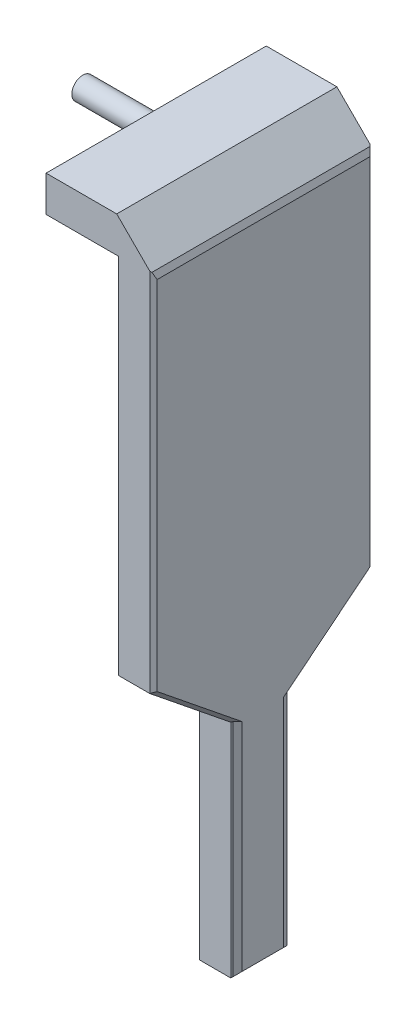
ISO-10303-21;
HEADER;
FILE_DESCRIPTION(('STEP AP214'),'2;1');
FILE_NAME('part.step','',(''),(''),'','','');
FILE_SCHEMA(('AUTOMOTIVE_DESIGN { 1 0 10303 214 1 1 1 1 }'));
ENDSEC;
DATA;
#1=APPLICATION_CONTEXT('core data for automotive mechanical design processes');
#2=APPLICATION_PROTOCOL_DEFINITION('international standard','automotive_design',2000,#1);
#3=PRODUCT_CONTEXT('',#1,'mechanical');
#4=PRODUCT('Part','Part','',(#3));
#5=PRODUCT_RELATED_PRODUCT_CATEGORY('part','',(#4));
#6=PRODUCT_DEFINITION_FORMATION('','',#4);
#7=PRODUCT_DEFINITION_CONTEXT('part definition',#1,'design');
#8=PRODUCT_DEFINITION('design','',#6,#7);
#9=PRODUCT_DEFINITION_SHAPE('','',#8);
#10=(LENGTH_UNIT() NAMED_UNIT(*) SI_UNIT(.MILLI.,.METRE.));
#11=(NAMED_UNIT(*) PLANE_ANGLE_UNIT() SI_UNIT($,.RADIAN.));
#12=(NAMED_UNIT(*) SI_UNIT($,.STERADIAN.) SOLID_ANGLE_UNIT());
#13=UNCERTAINTY_MEASURE_WITH_UNIT(LENGTH_MEASURE(1.E-05),#10,'distance_accuracy_value','');
#14=(GEOMETRIC_REPRESENTATION_CONTEXT(3) GLOBAL_UNCERTAINTY_ASSIGNED_CONTEXT((#13)) GLOBAL_UNIT_ASSIGNED_CONTEXT((#10,
#11,#12)) REPRESENTATION_CONTEXT('',''));
#15=CARTESIAN_POINT('',(0.,0.,0.));
#16=DIRECTION('',(0.,0.,1.));
#17=DIRECTION('',(1.,0.,0.));
#18=AXIS2_PLACEMENT_3D('',#15,#16,#17);
#19=CARTESIAN_POINT('',(-2.46265411376953,3.73344910144806,1.5));
#20=DIRECTION('',(-1.,0.,0.));
#21=DIRECTION('',(0.,0.,1.));
#22=AXIS2_PLACEMENT_3D('',#19,#20,#21);
#23=PLANE('',#22);
#24=CARTESIAN_POINT('',(-2.46265411376953,3.73344910144806,1.5));
#25=DIRECTION('',(-1.,0.,0.));
#26=DIRECTION('',(0.,0.,1.));
#27=AXIS2_PLACEMENT_3D('',#24,#25,#26);
#28=CIRCLE('',#27,0.15);
#29=CARTESIAN_POINT('',(-2.46265411376953,3.73344910144806,1.65));
#30=VERTEX_POINT('',#29);
#31=EDGE_CURVE('E20',#30,#30,#28,.F.);
#32=ORIENTED_EDGE('',*,*,#31,.F.);
#33=EDGE_LOOP('',(#32));
#34=FACE_BOUND('',#33,.T.);
#35=ADVANCED_FACE('F17',(#34),#23,.T.);
#36=CARTESIAN_POINT('',(-0.249999999999999,3.72729980945588,0.));
#37=DIRECTION('',(0.707106781186554,0.707106781186541,0.));
#38=DIRECTION('',(-0.707106781186541,0.707106781186554,0.));
#39=AXIS2_PLACEMENT_3D('',#36,#37,#38);
#40=PLANE('',#39);
#41=DIRECTION('',(0.577350269189646,-0.57735026918965,-0.577350269189581));
#42=VECTOR('',#41,1.);
#43=CARTESIAN_POINT('',(-0.0499999999999962,3.52729980945587,3.));
#44=LINE('',#43,#42);
#45=CARTESIAN_POINT('',(-0.049999999999998,3.52729980945587,3.));
#46=VERTEX_POINT('',#45);
#47=CARTESIAN_POINT('',(-0.0353553390593261,3.5126551485152,2.98535533905933));
#48=VERTEX_POINT('',#47);
#49=EDGE_CURVE('E182',#46,#48,#44,.T.);
#50=ORIENTED_EDGE('',*,*,#49,.T.);
#51=DIRECTION('',(0.,0.,1.));
#52=VECTOR('',#51,1.);
#53=CARTESIAN_POINT('',(-0.0353553390593256,3.5126551485152,0.));
#54=LINE('',#53,#52);
#55=CARTESIAN_POINT('',(-0.0353553390593256,3.5126551485152,0.0146446609406731));
#56=VERTEX_POINT('',#55);
#57=EDGE_CURVE('E214',#56,#48,#54,.T.);
#58=ORIENTED_EDGE('',*,*,#57,.F.);
#59=DIRECTION('',(-0.577350269189601,0.577350269189613,-0.577350269189663));
#60=VECTOR('',#59,1.);
#61=CARTESIAN_POINT('',(-0.0353553390593249,3.5126551485152,0.0146446609406731));
#62=LINE('',#61,#60);
#63=CARTESIAN_POINT('',(-0.0499999999999982,3.52729980945587,0.));
#64=VERTEX_POINT('',#63);
#65=EDGE_CURVE('E200',#56,#64,#62,.T.);
#66=ORIENTED_EDGE('',*,*,#65,.T.);
#67=DIRECTION('',(-0.707106781186541,0.707106781186554,0.));
#68=VECTOR('',#67,1.);
#69=CARTESIAN_POINT('',(-0.249999999999999,3.72729980945588,0.));
#70=LINE('',#69,#68);
#71=CARTESIAN_POINT('',(-0.499999999999997,3.97729980945588,0.));
#72=VERTEX_POINT('',#71);
#73=EDGE_CURVE('E188',#64,#72,#70,.T.);
#74=ORIENTED_EDGE('',*,*,#73,.T.);
#75=DIRECTION('',(0.,0.,1.));
#76=VECTOR('',#75,1.);
#77=CARTESIAN_POINT('',(-0.499999999999998,3.97729980945588,0.));
#78=LINE('',#77,#76);
#79=CARTESIAN_POINT('',(-0.499999999999998,3.97729980945588,3.));
#80=VERTEX_POINT('',#79);
#81=EDGE_CURVE('E255',#80,#72,#78,.F.);
#82=ORIENTED_EDGE('',*,*,#81,.F.);
#83=DIRECTION('',(-0.707106781186541,0.707106781186554,0.));
#84=VECTOR('',#83,1.);
#85=CARTESIAN_POINT('',(-0.249999999999999,3.72729980945588,3.));
#86=LINE('',#85,#84);
#87=EDGE_CURVE('E199',#80,#46,#86,.F.);
#88=ORIENTED_EDGE('',*,*,#87,.T.);
#89=EDGE_LOOP('',(#50,#58,#66,#74,#82,#88));
#90=FACE_BOUND('',#89,.T.);
#91=ADVANCED_FACE('F212',(#90),#40,.T.);
#92=CARTESIAN_POINT('',(-0.0176776695296637,-1.69490341842175,1.83877759457087));
#93=DIRECTION('',(0.923879532511287,0.,0.382683432365089));
#94=DIRECTION('',(0.382683432365089,0.,-0.923879532511287));
#95=AXIS2_PLACEMENT_3D('',#92,#93,#94);
#96=PLANE('',#95);
#97=DIRECTION('',(0.,1.,0.));
#98=VECTOR('',#97,1.);
#99=CARTESIAN_POINT('',(-0.0353553390593237,-2.41558381915093,1.88145526410053));
#100=LINE('',#99,#98);
#101=CARTESIAN_POINT('',(-0.0353553390593261,-5.35147049189518,1.88145526410053));
#102=VERTEX_POINT('',#101);
#103=CARTESIAN_POINT('',(-0.0353553390593248,-2.3407707983818,1.88145526410053));
#104=VERTEX_POINT('',#103);
#105=EDGE_CURVE('E245',#102,#104,#100,.T.);
#106=ORIENTED_EDGE('',*,*,#105,.F.);
#107=DIRECTION('',(0.357406744336585,0.357406744336647,-0.862856209460998));
#108=VECTOR('',#107,1.);
#109=CARTESIAN_POINT('',(-0.035355339059326,-5.35147049189518,1.88145526410053));
#110=LINE('',#109,#108);
#111=CARTESIAN_POINT('',(0.,-5.31611515283585,1.79609992504121));
#112=VERTEX_POINT('',#111);
#113=EDGE_CURVE('E269',#102,#112,#110,.T.);
#114=ORIENTED_EDGE('',*,*,#113,.T.);
#115=DIRECTION('',(0.,1.,0.));
#116=VECTOR('',#115,1.);
#117=CARTESIAN_POINT('',(0.,-0.974223017692566,1.79609992504121));
#118=LINE('',#117,#116);
#119=CARTESIAN_POINT('',(0.,-2.36418578676339,1.79609992504121));
#120=VERTEX_POINT('',#119);
#121=EDGE_CURVE('E236',#120,#112,#118,.F.);
#122=ORIENTED_EDGE('',*,*,#121,.F.);
#123=DIRECTION('',(-0.370955086235393,0.245674607156753,0.89556480022077));
#124=VECTOR('',#123,1.);
#125=CARTESIAN_POINT('',(0.,-2.36418578676339,1.79609992504121));
#126=LINE('',#125,#124);
#127=EDGE_CURVE('E271',#120,#104,#126,.T.);
#128=ORIENTED_EDGE('',*,*,#127,.T.);
#129=EDGE_LOOP('',(#106,#114,#122,#128));
#130=FACE_BOUND('',#129,.T.);
#131=ADVANCED_FACE('F491',(#130),#96,.T.);
#132=CARTESIAN_POINT('',(-0.0176776695296637,-1.69490341842175,1.18553132533577));
#133=DIRECTION('',(0.923879532511286,0.,-0.382683432365091));
#134=DIRECTION('',(-0.382683432365091,0.,-0.923879532511286));
#135=AXIS2_PLACEMENT_3D('',#132,#133,#134);
#136=PLANE('',#135);
#137=DIRECTION('',(0.,1.,0.));
#138=VECTOR('',#137,1.);
#139=CARTESIAN_POINT('',(-0.0353553390593287,-2.41558381915093,1.1428536558061));
#140=LINE('',#139,#138);
#141=CARTESIAN_POINT('',(-0.0353553390593299,-2.34077079838181,1.1428536558061));
#142=VERTEX_POINT('',#141);
#143=CARTESIAN_POINT('',(-0.0353553390593292,-5.35147049189518,1.1428536558061));
#144=VERTEX_POINT('',#143);
#145=EDGE_CURVE('E251',#142,#144,#140,.F.);
#146=ORIENTED_EDGE('',*,*,#145,.F.);
#147=DIRECTION('',(0.370955086235407,-0.245674607156632,0.895564800220797));
#148=VECTOR('',#147,1.);
#149=CARTESIAN_POINT('',(-0.0353553390593296,-2.34077079838181,1.1428536558061));
#150=LINE('',#149,#148);
#151=CARTESIAN_POINT('',(0.,-2.36418578676339,1.22820899486543));
#152=VERTEX_POINT('',#151);
#153=EDGE_CURVE('E265',#142,#152,#150,.T.);
#154=ORIENTED_EDGE('',*,*,#153,.T.);
#155=DIRECTION('',(0.,1.,0.));
#156=VECTOR('',#155,1.);
#157=CARTESIAN_POINT('',(0.,-0.974223017692566,1.22820899486543));
#158=LINE('',#157,#156);
#159=CARTESIAN_POINT('',(0.,-5.31611515283585,1.22820899486543));
#160=VERTEX_POINT('',#159);
#161=EDGE_CURVE('E228',#160,#152,#158,.T.);
#162=ORIENTED_EDGE('',*,*,#161,.F.);
#163=DIRECTION('',(-0.357406744336591,-0.357406744336616,-0.862856209461008));
#164=VECTOR('',#163,1.);
#165=CARTESIAN_POINT('',(0.,-5.31611515283585,1.22820899486543));
#166=LINE('',#165,#164);
#167=EDGE_CURVE('E267',#160,#144,#166,.T.);
#168=ORIENTED_EDGE('',*,*,#167,.T.);
#169=EDGE_LOOP('',(#146,#154,#162,#168));
#170=FACE_BOUND('',#169,.T.);
#171=ADVANCED_FACE('F484',(#170),#136,.T.);
#172=CARTESIAN_POINT('',(-0.0176776695296635,3.46997747898554,0.));
#173=DIRECTION('',(0.923879532511289,0.382683432365085,0.));
#174=DIRECTION('',(-0.382683432365085,0.923879532511289,0.));
#175=AXIS2_PLACEMENT_3D('',#172,#173,#174);
#176=PLANE('',#175);
#177=DIRECTION('',(0.,0.,-1.));
#178=VECTOR('',#177,1.);
#179=CARTESIAN_POINT('',(0.,3.42729980945587,0.));
#180=LINE('',#179,#178);
#181=CARTESIAN_POINT('',(0.,3.42729980945587,0.0499999999999999));
#182=VERTEX_POINT('',#181);
#183=CARTESIAN_POINT('',(0.,3.42729980945587,2.95));
#184=VERTEX_POINT('',#183);
#185=EDGE_CURVE('E221',#182,#184,#180,.F.);
#186=ORIENTED_EDGE('',*,*,#185,.F.);
#187=DIRECTION('',(-0.357406744336591,0.862856209461023,-0.357406744336581));
#188=VECTOR('',#187,1.);
#189=CARTESIAN_POINT('',(0.,3.42729980945587,0.05));
#190=LINE('',#189,#188);
#191=EDGE_CURVE('E260',#182,#56,#190,.T.);
#192=ORIENTED_EDGE('',*,*,#191,.T.);
#193=ORIENTED_EDGE('',*,*,#57,.T.);
#194=DIRECTION('',(0.357406744336586,-0.862856209461012,-0.357406744336612));
#195=VECTOR('',#194,1.);
#196=CARTESIAN_POINT('',(-0.0353553390593256,3.5126551485152,2.98535533905933));
#197=LINE('',#196,#195);
#198=EDGE_CURVE('E262',#48,#184,#197,.T.);
#199=ORIENTED_EDGE('',*,*,#198,.T.);
#200=EDGE_LOOP('',(#186,#192,#193,#199));
#201=FACE_BOUND('',#200,.T.);
#202=ADVANCED_FACE('F739',(#201),#176,.T.);
#203=CARTESIAN_POINT('',(-1.46265411376953,3.73344910144806,1.5));
#204=DIRECTION('',(-1.,0.,0.));
#205=DIRECTION('',(0.,0.,1.));
#206=AXIS2_PLACEMENT_3D('',#203,#204,#205);
#207=CYLINDRICAL_SURFACE('',#206,0.15);
#208=CARTESIAN_POINT('',(-1.46265411376953,3.73344910144806,1.5));
#209=DIRECTION('',(-1.,0.,0.));
#210=DIRECTION('',(0.,0.,1.));
#211=AXIS2_PLACEMENT_3D('',#208,#209,#210);
#212=CIRCLE('',#211,0.15);
#213=CARTESIAN_POINT('',(-1.46265411376953,3.73344910144806,1.65));
#214=VERTEX_POINT('',#213);
#215=EDGE_CURVE('E218',#214,#214,#212,.F.);
#216=ORIENTED_EDGE('',*,*,#215,.F.);
#217=EDGE_LOOP('',(#216));
#218=FACE_BOUND('',#217,.T.);
#219=ORIENTED_EDGE('',*,*,#31,.T.);
#220=EDGE_LOOP('',(#219));
#221=FACE_BOUND('',#220,.T.);
#222=ADVANCED_FACE('F731',(#218,#221),#207,.T.);
#223=CARTESIAN_POINT('',(-0.981327056884762,3.97729980945588,0.));
#224=DIRECTION('',(0.,1.,0.));
#225=DIRECTION('',(0.,0.,1.));
#226=AXIS2_PLACEMENT_3D('',#223,#224,#225);
#227=PLANE('',#226);
#228=DIRECTION('',(1.,0.,0.));
#229=VECTOR('',#228,1.);
#230=CARTESIAN_POINT('',(-0.981327056884762,3.97729980945588,0.));
#231=LINE('',#230,#229);
#232=CARTESIAN_POINT('',(-1.46265411376953,3.97729980945588,0.));
#233=VERTEX_POINT('',#232);
#234=EDGE_CURVE('E194',#72,#233,#231,.F.);
#235=ORIENTED_EDGE('',*,*,#234,.T.);
#236=DIRECTION('',(0.,0.,1.));
#237=VECTOR('',#236,1.);
#238=CARTESIAN_POINT('',(-1.46265411376953,3.97729980945588,0.));
#239=LINE('',#238,#237);
#240=CARTESIAN_POINT('',(-1.46265411376953,3.97729980945588,3.));
#241=VERTEX_POINT('',#240);
#242=EDGE_CURVE('E225',#241,#233,#239,.F.);
#243=ORIENTED_EDGE('',*,*,#242,.F.);
#244=DIRECTION('',(1.,0.,0.));
#245=VECTOR('',#244,1.);
#246=CARTESIAN_POINT('',(-0.981327056884762,3.97729980945588,3.));
#247=LINE('',#246,#245);
#248=EDGE_CURVE('E257',#241,#80,#247,.T.);
#249=ORIENTED_EDGE('',*,*,#248,.T.);
#250=ORIENTED_EDGE('',*,*,#81,.T.);
#251=EDGE_LOOP('',(#235,#243,#249,#250));
#252=FACE_BOUND('',#251,.T.);
#253=ADVANCED_FACE('F362',(#252),#227,.T.);
#254=CARTESIAN_POINT('',(-0.025,-2.41558381915093,1.15320899486543));
#255=DIRECTION('',(0.707106781186548,0.,-0.707106781186547));
#256=DIRECTION('',(-0.707106781186547,0.,-0.707106781186548));
#257=AXIS2_PLACEMENT_3D('',#254,#255,#256);
#258=PLANE('',#257);
#259=DIRECTION('',(0.,1.,0.));
#260=VECTOR('',#259,1.);
#261=CARTESIAN_POINT('',(-0.05,-3.85694462060929,1.12820899486543));
#262=LINE('',#261,#260);
#263=CARTESIAN_POINT('',(-0.05,-5.36611515283585,1.12820899486543));
#264=VERTEX_POINT('',#263);
#265=CARTESIAN_POINT('',(-0.0500000000000003,-2.34777408838273,1.12820899486543));
#266=VERTEX_POINT('',#265);
#267=EDGE_CURVE('E343',#264,#266,#262,.T.);
#268=ORIENTED_EDGE('',*,*,#267,.T.);
#269=DIRECTION('',(-0.669846433942967,-0.320330313688414,-0.669846433943014));
#270=VECTOR('',#269,1.);
#271=CARTESIAN_POINT('',(-0.0353553390593315,-2.34077079838181,1.1428536558061));
#272=LINE('',#271,#270);
#273=EDGE_CURVE('E348',#142,#266,#272,.T.);
#274=ORIENTED_EDGE('',*,*,#273,.F.);
#275=ORIENTED_EDGE('',*,*,#145,.T.);
#276=DIRECTION('',(-0.577350269189648,-0.577350269189581,-0.577350269189649));
#277=VECTOR('',#276,1.);
#278=CARTESIAN_POINT('',(-0.0353553390593287,-5.35147049189518,1.1428536558061));
#279=LINE('',#278,#277);
#280=EDGE_CURVE('E248',#144,#264,#279,.T.);
#281=ORIENTED_EDGE('',*,*,#280,.T.);
#282=EDGE_LOOP('',(#268,#274,#275,#281));
#283=FACE_BOUND('',#282,.T.);
#284=ADVANCED_FACE('F474',(#283),#258,.T.);
#285=CARTESIAN_POINT('',(-0.025,-2.41558381915093,1.87109992504121));
#286=DIRECTION('',(0.707106781186548,0.,0.707106781186547));
#287=DIRECTION('',(0.707106781186547,0.,-0.707106781186548));
#288=AXIS2_PLACEMENT_3D('',#285,#286,#287);
#289=PLANE('',#288);
#290=DIRECTION('',(-0.66984643394293,-0.320330313688663,0.669846433942932));
#291=VECTOR('',#290,1.);
#292=CARTESIAN_POINT('',(-0.0353553390593237,-2.3407707983818,1.88145526410053));
#293=LINE('',#292,#291);
#294=CARTESIAN_POINT('',(-0.0500000000000002,-2.34777408838273,1.89609992504121));
#295=VERTEX_POINT('',#294);
#296=EDGE_CURVE('E242',#104,#295,#293,.T.);
#297=ORIENTED_EDGE('',*,*,#296,.T.);
#298=DIRECTION('',(0.,1.,0.));
#299=VECTOR('',#298,1.);
#300=CARTESIAN_POINT('',(-0.05,-3.85694462060929,1.89609992504121));
#301=LINE('',#300,#299);
#302=CARTESIAN_POINT('',(-0.05,-5.36611515283585,1.89609992504121));
#303=VERTEX_POINT('',#302);
#304=EDGE_CURVE('E333',#295,#303,#301,.F.);
#305=ORIENTED_EDGE('',*,*,#304,.T.);
#306=DIRECTION('',(-0.577350269189508,-0.577350269189514,0.577350269189856));
#307=VECTOR('',#306,1.);
#308=CARTESIAN_POINT('',(-0.0353553390593286,-5.35147049189518,1.88145526410053));
#309=LINE('',#308,#307);
#310=EDGE_CURVE('E337',#102,#303,#309,.T.);
#311=ORIENTED_EDGE('',*,*,#310,.F.);
#312=ORIENTED_EDGE('',*,*,#105,.T.);
#313=EDGE_LOOP('',(#297,#305,#311,#312));
#314=FACE_BOUND('',#313,.T.);
#315=ADVANCED_FACE('F494',(#314),#289,.T.);
#316=CARTESIAN_POINT('',(0.,-0.974223017692566,0.));
#317=DIRECTION('',(1.,0.,0.));
#318=DIRECTION('',(0.,0.,-1.));
#319=AXIS2_PLACEMENT_3D('',#316,#317,#318);
#320=PLANE('',#319);
#321=ORIENTED_EDGE('',*,*,#185,.T.);
#322=DIRECTION('',(0.,1.,0.));
#323=VECTOR('',#322,1.);
#324=CARTESIAN_POINT('',(0.,-0.687940733754938,2.95));
#325=LINE('',#324,#323);
#326=CARTESIAN_POINT('',(0.,-1.43362477716847,2.95));
#327=VERTEX_POINT('',#326);
#328=EDGE_CURVE('E327',#327,#184,#325,.T.);
#329=ORIENTED_EDGE('',*,*,#328,.F.);
#330=DIRECTION('',(0.,0.627750993166892,0.778414215297987));
#331=VECTOR('',#330,1.);
#332=CARTESIAN_POINT('',(0.,-2.36418578676339,1.79609992504121));
#333=LINE('',#332,#331);
#334=EDGE_CURVE('E331',#120,#327,#333,.T.);
#335=ORIENTED_EDGE('',*,*,#334,.F.);
#336=ORIENTED_EDGE('',*,*,#121,.T.);
#337=DIRECTION('',(0.,0.,1.));
#338=VECTOR('',#337,1.);
#339=CARTESIAN_POINT('',(0.,-5.31611515283585,0.756077229976659));
#340=LINE('',#339,#338);
#341=EDGE_CURVE('E340',#160,#112,#340,.T.);
#342=ORIENTED_EDGE('',*,*,#341,.F.);
#343=ORIENTED_EDGE('',*,*,#161,.T.);
#344=DIRECTION('',(0.,-0.627750993166894,0.778414215297985));
#345=VECTOR('',#344,1.);
#346=CARTESIAN_POINT('',(0.,-1.41402088464658,0.0500000000000002));
#347=LINE('',#346,#345);
#348=CARTESIAN_POINT('',(0.,-1.41402088464658,0.05));
#349=VERTEX_POINT('',#348);
#350=EDGE_CURVE('E351',#349,#152,#347,.T.);
#351=ORIENTED_EDGE('',*,*,#350,.F.);
#352=DIRECTION('',(0.,1.,0.));
#353=VECTOR('',#352,1.);
#354=CARTESIAN_POINT('',(0.,-0.687940733754938,0.05));
#355=LINE('',#354,#353);
#356=EDGE_CURVE('E354',#182,#349,#355,.F.);
#357=ORIENTED_EDGE('',*,*,#356,.F.);
#358=EDGE_LOOP('',(#321,#329,#335,#336,#342,#343,#351,#357));
#359=FACE_BOUND('',#358,.T.);
#360=ADVANCED_FACE('F487',(#359),#320,.T.);
#361=CARTESIAN_POINT('',(-1.46265411376953,3.73344910144806,0.));
#362=DIRECTION('',(-1.,0.,0.));
#363=DIRECTION('',(0.,0.,1.));
#364=AXIS2_PLACEMENT_3D('',#361,#362,#363);
#365=PLANE('',#364);
#366=DIRECTION('',(0.,1.,0.));
#367=VECTOR('',#366,1.);
#368=CARTESIAN_POINT('',(-1.46265411376953,3.73344910144806,0.));
#369=LINE('',#368,#367);
#370=CARTESIAN_POINT('',(-1.46265411376953,3.48959839344024,0.));
#371=VERTEX_POINT('',#370);
#372=EDGE_CURVE('E356',#233,#371,#369,.F.);
#373=ORIENTED_EDGE('',*,*,#372,.T.);
#374=DIRECTION('',(0.,0.,-1.));
#375=VECTOR('',#374,1.);
#376=CARTESIAN_POINT('',(-1.46265411376953,3.48959839344024,0.));
#377=LINE('',#376,#375);
#378=CARTESIAN_POINT('',(-1.46265411376953,3.48959839344024,3.));
#379=VERTEX_POINT('',#378);
#380=EDGE_CURVE('E322',#379,#371,#377,.T.);
#381=ORIENTED_EDGE('',*,*,#380,.F.);
#382=DIRECTION('',(0.,1.,0.));
#383=VECTOR('',#382,1.);
#384=CARTESIAN_POINT('',(-1.46265411376953,3.73344910144806,3.));
#385=LINE('',#384,#383);
#386=EDGE_CURVE('E220',#379,#241,#385,.T.);
#387=ORIENTED_EDGE('',*,*,#386,.T.);
#388=ORIENTED_EDGE('',*,*,#242,.T.);
#389=EDGE_LOOP('',(#373,#381,#387,#388));
#390=FACE_BOUND('',#389,.T.);
#391=ORIENTED_EDGE('',*,*,#215,.T.);
#392=EDGE_LOOP('',(#391));
#393=FACE_BOUND('',#392,.T.);
#394=ADVANCED_FACE('F359',(#390,#393),#365,.T.);
#395=CARTESIAN_POINT('',(-0.025,-0.687940733754938,0.025));
#396=DIRECTION('',(0.707106781186547,0.,-0.707106781186548));
#397=DIRECTION('',(-0.707106781186548,0.,-0.707106781186547));
#398=AXIS2_PLACEMENT_3D('',#395,#396,#397);
#399=PLANE('',#398);
#400=ORIENTED_EDGE('',*,*,#65,.F.);
#401=ORIENTED_EDGE('',*,*,#191,.F.);
#402=ORIENTED_EDGE('',*,*,#356,.T.);
#403=DIRECTION('',(0.66984643394299,0.320330313688518,0.669846433942942));
#404=VECTOR('',#403,1.);
#405=CARTESIAN_POINT('',(-0.0500000000000024,-1.43793161234897,0.));
#406=LINE('',#405,#404);
#407=CARTESIAN_POINT('',(-0.0500000000000006,-1.43793161234897,0.));
#408=VERTEX_POINT('',#407);
#409=EDGE_CURVE('E207',#408,#349,#406,.T.);
#410=ORIENTED_EDGE('',*,*,#409,.F.);
#411=DIRECTION('',(0.,1.,0.));
#412=VECTOR('',#411,1.);
#413=CARTESIAN_POINT('',(-0.05,-0.401658449817309,0.));
#414=LINE('',#413,#412);
#415=EDGE_CURVE('E192',#408,#64,#414,.T.);
#416=ORIENTED_EDGE('',*,*,#415,.T.);
#417=EDGE_LOOP('',(#400,#401,#402,#410,#416));
#418=FACE_BOUND('',#417,.T.);
#419=ADVANCED_FACE('F203',(#418),#399,.T.);
#420=CARTESIAN_POINT('',(-0.025,-1.54006611336187,0.166471974713435));
#421=DIRECTION('',(0.707106781186547,-0.550421970209211,-0.443886984164901));
#422=DIRECTION('',(0.614253485987459,0.789108772573372,0.));
#423=AXIS2_PLACEMENT_3D('',#420,#421,#422);
#424=PLANE('',#423);
#425=DIRECTION('',(0.,-0.627750993166894,0.778414215297985));
#426=VECTOR('',#425,1.);
#427=CARTESIAN_POINT('',(-0.05,-1.86385557822617,0.528147742152223));
#428=LINE('',#427,#426);
#429=EDGE_CURVE('E314',#266,#408,#428,.F.);
#430=ORIENTED_EDGE('',*,*,#429,.T.);
#431=ORIENTED_EDGE('',*,*,#409,.T.);
#432=ORIENTED_EDGE('',*,*,#350,.T.);
#433=ORIENTED_EDGE('',*,*,#153,.F.);
#434=ORIENTED_EDGE('',*,*,#273,.T.);
#435=EDGE_LOOP('',(#430,#431,#432,#433,#434));
#436=FACE_BOUND('',#435,.T.);
#437=ADVANCED_FACE('F481',(#436),#424,.T.);
#438=CARTESIAN_POINT('',(0.,-3.85694462060929,1.12820899486543));
#439=DIRECTION('',(0.,0.,1.));
#440=DIRECTION('',(1.,0.,0.));
#441=AXIS2_PLACEMENT_3D('',#438,#439,#440);
#442=PLANE('',#441);
#443=DIRECTION('',(1.,0.,0.));
#444=VECTOR('',#443,1.);
#445=CARTESIAN_POINT('',(0.,-2.34777408838273,1.12820899486543));
#446=LINE('',#445,#444);
#447=CARTESIAN_POINT('',(-0.476725769042962,-2.34777408838273,1.12820899486543));
#448=VERTEX_POINT('',#447);
#449=EDGE_CURVE('E316',#448,#266,#446,.T.);
#450=ORIENTED_EDGE('',*,*,#449,.T.);
#451=ORIENTED_EDGE('',*,*,#267,.F.);
#452=DIRECTION('',(1.,0.,0.));
#453=VECTOR('',#452,1.);
#454=CARTESIAN_POINT('',(0.,-5.36611515283585,1.12820899486543));
#455=LINE('',#454,#453);
#456=CARTESIAN_POINT('',(-0.476725769042962,-5.36611515283585,1.12820899486543));
#457=VERTEX_POINT('',#456);
#458=EDGE_CURVE('E345',#457,#264,#455,.T.);
#459=ORIENTED_EDGE('',*,*,#458,.F.);
#460=DIRECTION('',(0.,1.,0.));
#461=VECTOR('',#460,1.);
#462=CARTESIAN_POINT('',(-0.476725769042962,-2.41250917315484,1.12820899486543));
#463=LINE('',#462,#461);
#464=EDGE_CURVE('E309',#448,#457,#463,.F.);
#465=ORIENTED_EDGE('',*,*,#464,.F.);
#466=EDGE_LOOP('',(#450,#451,#459,#465));
#467=FACE_BOUND('',#466,.T.);
#468=ADVANCED_FACE('F478',(#467),#442,.F.);
#469=CARTESIAN_POINT('',(-0.025,-5.34111515283585,0.756077229976659));
#470=DIRECTION('',(0.707106781186548,-0.707106781186547,0.));
#471=DIRECTION('',(0.707106781186547,0.707106781186548,0.));
#472=AXIS2_PLACEMENT_3D('',#469,#470,#471);
#473=PLANE('',#472);
#474=ORIENTED_EDGE('',*,*,#113,.F.);
#475=ORIENTED_EDGE('',*,*,#310,.T.);
#476=DIRECTION('',(0.,0.,1.));
#477=VECTOR('',#476,1.);
#478=CARTESIAN_POINT('',(-0.05,-5.36611515283585,1.51215445995332));
#479=LINE('',#478,#477);
#480=EDGE_CURVE('E301',#303,#264,#479,.F.);
#481=ORIENTED_EDGE('',*,*,#480,.T.);
#482=ORIENTED_EDGE('',*,*,#280,.F.);
#483=ORIENTED_EDGE('',*,*,#167,.F.);
#484=ORIENTED_EDGE('',*,*,#341,.T.);
#485=EDGE_LOOP('',(#474,#475,#481,#482,#483,#484));
#486=FACE_BOUND('',#485,.T.);
#487=ADVANCED_FACE('F470',(#486),#473,.T.);
#488=CARTESIAN_POINT('',(0.,-3.85694462060929,1.89609992504121));
#489=DIRECTION('',(0.,0.,-1.));
#490=DIRECTION('',(-1.,0.,0.));
#491=AXIS2_PLACEMENT_3D('',#488,#489,#490);
#492=PLANE('',#491);
#493=DIRECTION('',(1.,0.,0.));
#494=VECTOR('',#493,1.);
#495=CARTESIAN_POINT('',(0.,-5.36611515283585,1.89609992504121));
#496=LINE('',#495,#494);
#497=CARTESIAN_POINT('',(-0.476725769042962,-5.36611515283585,1.89609992504121));
#498=VERTEX_POINT('',#497);
#499=EDGE_CURVE('E304',#498,#303,#496,.T.);
#500=ORIENTED_EDGE('',*,*,#499,.T.);
#501=ORIENTED_EDGE('',*,*,#304,.F.);
#502=DIRECTION('',(-1.,0.,0.));
#503=VECTOR('',#502,1.);
#504=CARTESIAN_POINT('',(0.,-2.34777408838273,1.89609992504121));
#505=LINE('',#504,#503);
#506=CARTESIAN_POINT('',(-0.476725769042962,-2.34777408838273,1.89609992504121));
#507=VERTEX_POINT('',#506);
#508=EDGE_CURVE('E335',#507,#295,#505,.F.);
#509=ORIENTED_EDGE('',*,*,#508,.F.);
#510=DIRECTION('',(0.,1.,0.));
#511=VECTOR('',#510,1.);
#512=CARTESIAN_POINT('',(-0.476725769042962,-2.41250917315484,1.89609992504121));
#513=LINE('',#512,#511);
#514=EDGE_CURVE('E298',#498,#507,#513,.T.);
#515=ORIENTED_EDGE('',*,*,#514,.F.);
#516=EDGE_LOOP('',(#500,#501,#509,#515));
#517=FACE_BOUND('',#516,.T.);
#518=ADVANCED_FACE('F462',(#517),#492,.F.);
#519=CARTESIAN_POINT('',(-0.025,-2.26788363224052,1.9553397623852));
#520=DIRECTION('',(0.707106781186547,-0.550421970209213,0.443886984164899));
#521=DIRECTION('',(0.61425348598746,0.789108772573372,0.));
#522=AXIS2_PLACEMENT_3D('',#519,#520,#521);
#523=PLANE('',#522);
#524=ORIENTED_EDGE('',*,*,#296,.F.);
#525=ORIENTED_EDGE('',*,*,#127,.F.);
#526=ORIENTED_EDGE('',*,*,#334,.T.);
#527=DIRECTION('',(0.669846433942988,0.320330313688423,-0.669846433942989));
#528=VECTOR('',#527,1.);
#529=CARTESIAN_POINT('',(-0.0500000000000002,-1.45753550487085,3.));
#530=LINE('',#529,#528);
#531=CARTESIAN_POINT('',(-0.0499999999999989,-1.45753550487085,3.));
#532=VERTEX_POINT('',#531);
#533=EDGE_CURVE('E329',#532,#327,#530,.T.);
#534=ORIENTED_EDGE('',*,*,#533,.F.);
#535=DIRECTION('',(0.,0.627750993166891,0.778414215297988));
#536=VECTOR('',#535,1.);
#537=CARTESIAN_POINT('',(-0.05,-1.84166116481183,2.52368235588074));
#538=LINE('',#537,#536);
#539=EDGE_CURVE('E293',#532,#295,#538,.F.);
#540=ORIENTED_EDGE('',*,*,#539,.T.);
#541=EDGE_LOOP('',(#524,#525,#526,#534,#540));
#542=FACE_BOUND('',#541,.T.);
#543=ADVANCED_FACE('F496',(#542),#523,.T.);
#544=CARTESIAN_POINT('',(-0.025,-0.687940733754938,2.975));
#545=DIRECTION('',(0.707106781186548,0.,0.707106781186547));
#546=DIRECTION('',(0.707106781186547,0.,-0.707106781186548));
#547=AXIS2_PLACEMENT_3D('',#544,#545,#546);
#548=PLANE('',#547);
#549=ORIENTED_EDGE('',*,*,#198,.F.);
#550=ORIENTED_EDGE('',*,*,#49,.F.);
#551=DIRECTION('',(0.,1.,0.));
#552=VECTOR('',#551,1.);
#553=CARTESIAN_POINT('',(-0.05,-0.401658449817309,3.));
#554=LINE('',#553,#552);
#555=EDGE_CURVE('E278',#532,#46,#554,.T.);
#556=ORIENTED_EDGE('',*,*,#555,.F.);
#557=ORIENTED_EDGE('',*,*,#533,.T.);
#558=ORIENTED_EDGE('',*,*,#328,.T.);
#559=EDGE_LOOP('',(#549,#550,#556,#557,#558));
#560=FACE_BOUND('',#559,.T.);
#561=ADVANCED_FACE('F646',(#560),#548,.T.);
#562=CARTESIAN_POINT('',(-0.994689941406244,3.48959839344024,0.));
#563=DIRECTION('',(0.,-1.,0.));
#564=DIRECTION('',(0.,0.,-1.));
#565=AXIS2_PLACEMENT_3D('',#562,#563,#564);
#566=PLANE('',#565);
#567=DIRECTION('',(-0.707106781186547,0.,0.707106781186548));
#568=VECTOR('',#567,1.);
#569=CARTESIAN_POINT('',(-0.476725769042962,3.48959839344024,0.));
#570=LINE('',#569,#568);
#571=CARTESIAN_POINT('',(-0.476725769042962,3.48959839344024,0.));
#572=VERTEX_POINT('',#571);
#573=CARTESIAN_POINT('',(-0.576725769042962,3.48959839344024,0.1));
#574=VERTEX_POINT('',#573);
#575=EDGE_CURVE('E210',#572,#574,#570,.T.);
#576=ORIENTED_EDGE('',*,*,#575,.T.);
#577=DIRECTION('',(0.,0.,1.));
#578=VECTOR('',#577,1.);
#579=CARTESIAN_POINT('',(-0.576725769042962,3.48959839344024,0.));
#580=LINE('',#579,#578);
#581=CARTESIAN_POINT('',(-0.576725769042962,3.48959839344024,2.9));
#582=VERTEX_POINT('',#581);
#583=EDGE_CURVE('E282',#582,#574,#580,.F.);
#584=ORIENTED_EDGE('',*,*,#583,.F.);
#585=DIRECTION('',(0.707106781186546,0.,0.707106781186549));
#586=VECTOR('',#585,1.);
#587=CARTESIAN_POINT('',(-0.576725769042962,3.48959839344024,2.9));
#588=LINE('',#587,#586);
#589=CARTESIAN_POINT('',(-0.476725769042962,3.48959839344024,3.));
#590=VERTEX_POINT('',#589);
#591=EDGE_CURVE('E325',#582,#590,#588,.T.);
#592=ORIENTED_EDGE('',*,*,#591,.T.);
#593=DIRECTION('',(1.,0.,0.));
#594=VECTOR('',#593,1.);
#595=CARTESIAN_POINT('',(-0.354521610411887,3.48959839344024,3.));
#596=LINE('',#595,#594);
#597=EDGE_CURVE('E287',#379,#590,#596,.T.);
#598=ORIENTED_EDGE('',*,*,#597,.F.);
#599=ORIENTED_EDGE('',*,*,#380,.T.);
#600=DIRECTION('',(1.,0.,0.));
#601=VECTOR('',#600,1.);
#602=CARTESIAN_POINT('',(-0.354521610411887,3.48959839344024,0.));
#603=LINE('',#602,#601);
#604=EDGE_CURVE('E209',#371,#572,#603,.T.);
#605=ORIENTED_EDGE('',*,*,#604,.T.);
#606=EDGE_LOOP('',(#576,#584,#592,#598,#599,#605));
#607=FACE_BOUND('',#606,.T.);
#608=ADVANCED_FACE('F367',(#607),#566,.T.);
#609=CARTESIAN_POINT('',(-0.354521610411887,-0.401658449817309,0.));
#610=DIRECTION('',(0.,0.,1.));
#611=DIRECTION('',(1.,0.,0.));
#612=AXIS2_PLACEMENT_3D('',#609,#610,#611);
#613=PLANE('',#612);
#614=ORIENTED_EDGE('',*,*,#372,.F.);
#615=ORIENTED_EDGE('',*,*,#234,.F.);
#616=ORIENTED_EDGE('',*,*,#73,.F.);
#617=ORIENTED_EDGE('',*,*,#415,.F.);
#618=DIRECTION('',(1.,0.,0.));
#619=VECTOR('',#618,1.);
#620=CARTESIAN_POINT('',(0.,-1.43793161234897,0.));
#621=LINE('',#620,#619);
#622=CARTESIAN_POINT('',(-0.476725769042962,-1.43793161234897,0.));
#623=VERTEX_POINT('',#622);
#624=EDGE_CURVE('E312',#408,#623,#621,.F.);
#625=ORIENTED_EDGE('',*,*,#624,.T.);
#626=DIRECTION('',(0.,1.,0.));
#627=VECTOR('',#626,1.);
#628=CARTESIAN_POINT('',(-0.476725769042962,-0.684866087758845,0.));
#629=LINE('',#628,#627);
#630=EDGE_CURVE('E285',#572,#623,#629,.F.);
#631=ORIENTED_EDGE('',*,*,#630,.F.);
#632=ORIENTED_EDGE('',*,*,#604,.F.);
#633=EDGE_LOOP('',(#614,#615,#616,#617,#625,#631,#632));
#634=FACE_BOUND('',#633,.T.);
#635=ADVANCED_FACE('F191',(#634),#613,.F.);
#636=CARTESIAN_POINT('',(0.,-1.86385557822617,0.528147742152223));
#637=DIRECTION('',(0.,0.778414215297985,0.627750993166894));
#638=DIRECTION('',(0.,-0.627750993166894,0.778414215297985));
#639=AXIS2_PLACEMENT_3D('',#636,#637,#638);
#640=PLANE('',#639);
#641=ORIENTED_EDGE('',*,*,#624,.F.);
#642=ORIENTED_EDGE('',*,*,#429,.F.);
#643=ORIENTED_EDGE('',*,*,#449,.F.);
#644=DIRECTION('',(0.,-0.627750993166894,0.778414215297986));
#645=VECTOR('',#644,1.);
#646=CARTESIAN_POINT('',(-0.476725769042959,-1.43793161234897,0.));
#647=LINE('',#646,#645);
#648=EDGE_CURVE('E412',#623,#448,#647,.T.);
#649=ORIENTED_EDGE('',*,*,#648,.F.);
#650=EDGE_LOOP('',(#641,#642,#643,#649));
#651=FACE_BOUND('',#650,.T.);
#652=ADVANCED_FACE('F427',(#651),#640,.F.);
#653=CARTESIAN_POINT('',(-0.501725769042962,-2.41250917315484,1.15320899486543));
#654=DIRECTION('',(-0.707106781186548,0.,-0.707106781186547));
#655=DIRECTION('',(-0.707106781186547,0.,0.707106781186548));
#656=AXIS2_PLACEMENT_3D('',#653,#654,#655);
#657=PLANE('',#656);
#658=ORIENTED_EDGE('',*,*,#464,.T.);
#659=DIRECTION('',(-0.577350269189644,0.577350269189591,0.577350269189642));
#660=VECTOR('',#659,1.);
#661=CARTESIAN_POINT('',(-0.476725769042962,-5.36611515283585,1.12820899486543));
#662=LINE('',#661,#660);
#663=CARTESIAN_POINT('',(-0.491370429983633,-5.35147049189518,1.1428536558061));
#664=VERTEX_POINT('',#663);
#665=EDGE_CURVE('E307',#457,#664,#662,.T.);
#666=ORIENTED_EDGE('',*,*,#665,.T.);
#667=DIRECTION('',(0.,1.,0.));
#668=VECTOR('',#667,1.);
#669=CARTESIAN_POINT('',(-0.491370429983632,-1.69029144942761,1.1428536558061));
#670=LINE('',#669,#668);
#671=CARTESIAN_POINT('',(-0.491370429983633,-2.3407707983818,1.1428536558061));
#672=VERTEX_POINT('',#671);
#673=EDGE_CURVE('E404',#672,#664,#670,.F.);
#674=ORIENTED_EDGE('',*,*,#673,.F.);
#675=DIRECTION('',(-0.669846433943044,0.320330313688689,0.669846433942806));
#676=VECTOR('',#675,1.);
#677=CARTESIAN_POINT('',(-0.47672576904296,-2.34777408838273,1.12820899486543));
#678=LINE('',#677,#676);
#679=EDGE_CURVE('E410',#448,#672,#678,.T.);
#680=ORIENTED_EDGE('',*,*,#679,.F.);
#681=EDGE_LOOP('',(#658,#666,#674,#680));
#682=FACE_BOUND('',#681,.T.);
#683=ADVANCED_FACE('F616',(#682),#657,.T.);
#684=CARTESIAN_POINT('',(0.,-5.36611515283585,1.51215445995332));
#685=DIRECTION('',(0.,1.,0.));
#686=DIRECTION('',(0.,0.,1.));
#687=AXIS2_PLACEMENT_3D('',#684,#685,#686);
#688=PLANE('',#687);
#689=ORIENTED_EDGE('',*,*,#458,.T.);
#690=ORIENTED_EDGE('',*,*,#480,.F.);
#691=ORIENTED_EDGE('',*,*,#499,.F.);
#692=DIRECTION('',(0.,0.,1.));
#693=VECTOR('',#692,1.);
#694=CARTESIAN_POINT('',(-0.476725769042962,-5.36611515283585,0.756077229976659));
#695=LINE('',#694,#693);
#696=EDGE_CURVE('E401',#457,#498,#695,.T.);
#697=ORIENTED_EDGE('',*,*,#696,.F.);
#698=EDGE_LOOP('',(#689,#690,#691,#697));
#699=FACE_BOUND('',#698,.T.);
#700=ADVANCED_FACE('F467',(#699),#688,.F.);
#701=CARTESIAN_POINT('',(-0.501725769042962,-2.41250917315484,1.87109992504121));
#702=DIRECTION('',(-0.707106781186548,0.,0.707106781186547));
#703=DIRECTION('',(0.707106781186547,0.,0.707106781186548));
#704=AXIS2_PLACEMENT_3D('',#701,#702,#703);
#705=PLANE('',#704);
#706=ORIENTED_EDGE('',*,*,#514,.T.);
#707=DIRECTION('',(-0.66984643394293,0.32033031368867,-0.669846433942928));
#708=VECTOR('',#707,1.);
#709=CARTESIAN_POINT('',(-0.476725769042962,-2.34777408838273,1.89609992504121));
#710=LINE('',#709,#708);
#711=CARTESIAN_POINT('',(-0.491370429983637,-2.3407707983818,1.88145526410053));
#712=VERTEX_POINT('',#711);
#713=EDGE_CURVE('E296',#507,#712,#710,.T.);
#714=ORIENTED_EDGE('',*,*,#713,.T.);
#715=DIRECTION('',(0.,1.,0.));
#716=VECTOR('',#715,1.);
#717=CARTESIAN_POINT('',(-0.491370429983636,-1.69029144942761,1.88145526410053));
#718=LINE('',#717,#716);
#719=CARTESIAN_POINT('',(-0.491370429983635,-5.35147049189518,1.88145526410053));
#720=VERTEX_POINT('',#719);
#721=EDGE_CURVE('E390',#720,#712,#718,.T.);
#722=ORIENTED_EDGE('',*,*,#721,.F.);
#723=DIRECTION('',(-0.577350269189503,0.577350269189499,-0.577350269189875));
#724=VECTOR('',#723,1.);
#725=CARTESIAN_POINT('',(-0.476725769042962,-5.36611515283585,1.89609992504121));
#726=LINE('',#725,#724);
#727=EDGE_CURVE('E399',#498,#720,#726,.T.);
#728=ORIENTED_EDGE('',*,*,#727,.F.);
#729=EDGE_LOOP('',(#706,#714,#722,#728));
#730=FACE_BOUND('',#729,.T.);
#731=ADVANCED_FACE('F459',(#730),#705,.T.);
#732=CARTESIAN_POINT('',(0.,-1.84166116481183,2.52368235588074));
#733=DIRECTION('',(0.,0.778414215297988,-0.627750993166891));
#734=DIRECTION('',(0.,0.627750993166891,0.778414215297988));
#735=AXIS2_PLACEMENT_3D('',#732,#733,#734);
#736=PLANE('',#735);
#737=ORIENTED_EDGE('',*,*,#508,.T.);
#738=ORIENTED_EDGE('',*,*,#539,.F.);
#739=DIRECTION('',(1.,0.,0.));
#740=VECTOR('',#739,1.);
#741=CARTESIAN_POINT('',(-0.354521610411887,-1.45753550487085,3.));
#742=LINE('',#741,#740);
#743=CARTESIAN_POINT('',(-0.476725769042962,-1.45753550487085,3.));
#744=VERTEX_POINT('',#743);
#745=EDGE_CURVE('E280',#744,#532,#742,.T.);
#746=ORIENTED_EDGE('',*,*,#745,.F.);
#747=DIRECTION('',(0.,0.627750993166893,0.778414215297986));
#748=VECTOR('',#747,1.);
#749=CARTESIAN_POINT('',(-0.476725769042959,-2.34777408838273,1.89609992504121));
#750=LINE('',#749,#748);
#751=EDGE_CURVE('E385',#507,#744,#750,.T.);
#752=ORIENTED_EDGE('',*,*,#751,.F.);
#753=EDGE_LOOP('',(#737,#738,#746,#752));
#754=FACE_BOUND('',#753,.T.);
#755=ADVANCED_FACE('F499',(#754),#736,.F.);
#756=CARTESIAN_POINT('',(-0.354521610411887,-0.401658449817309,3.));
#757=DIRECTION('',(0.,0.,1.));
#758=DIRECTION('',(1.,0.,0.));
#759=AXIS2_PLACEMENT_3D('',#756,#757,#758);
#760=PLANE('',#759);
#761=ORIENTED_EDGE('',*,*,#248,.F.);
#762=ORIENTED_EDGE('',*,*,#386,.F.);
#763=ORIENTED_EDGE('',*,*,#597,.T.);
#764=DIRECTION('',(0.,1.,0.));
#765=VECTOR('',#764,1.);
#766=CARTESIAN_POINT('',(-0.476725769042962,-0.684866087758845,3.));
#767=LINE('',#766,#765);
#768=EDGE_CURVE('E371',#744,#590,#767,.T.);
#769=ORIENTED_EDGE('',*,*,#768,.F.);
#770=ORIENTED_EDGE('',*,*,#745,.T.);
#771=ORIENTED_EDGE('',*,*,#555,.T.);
#772=ORIENTED_EDGE('',*,*,#87,.F.);
#773=EDGE_LOOP('',(#761,#762,#763,#769,#770,#771,#772));
#774=FACE_BOUND('',#773,.T.);
#775=ADVANCED_FACE('F275',(#774),#760,.T.);
#776=CARTESIAN_POINT('',(-0.551725769042962,3.46459839344024,0.));
#777=DIRECTION('',(-0.707106781186548,-0.707106781186547,0.));
#778=DIRECTION('',(0.707106781186547,-0.707106781186548,0.));
#779=AXIS2_PLACEMENT_3D('',#776,#777,#778);
#780=PLANE('',#779);
#781=DIRECTION('',(0.577350269189627,-0.577350269189622,0.577350269189627));
#782=VECTOR('',#781,1.);
#783=CARTESIAN_POINT('',(-0.576725769042962,3.48959839344024,2.9));
#784=LINE('',#783,#782);
#785=CARTESIAN_POINT('',(-0.526725769042962,3.43959839344024,2.95));
#786=VERTEX_POINT('',#785);
#787=EDGE_CURVE('E380',#582,#786,#784,.T.);
#788=ORIENTED_EDGE('',*,*,#787,.F.);
#789=ORIENTED_EDGE('',*,*,#583,.T.);
#790=DIRECTION('',(-0.577350269189626,0.577350269189624,0.577350269189627));
#791=VECTOR('',#790,1.);
#792=CARTESIAN_POINT('',(-0.526725769042962,3.43959839344024,0.0500000000000001));
#793=LINE('',#792,#791);
#794=CARTESIAN_POINT('',(-0.526725769042962,3.43959839344024,0.0500000000000001));
#795=VERTEX_POINT('',#794);
#796=EDGE_CURVE('E418',#795,#574,#793,.T.);
#797=ORIENTED_EDGE('',*,*,#796,.F.);
#798=DIRECTION('',(0.,0.,1.));
#799=VECTOR('',#798,1.);
#800=CARTESIAN_POINT('',(-0.526725769042962,3.43959839344024,0.));
#801=LINE('',#800,#799);
#802=EDGE_CURVE('E375',#786,#795,#801,.F.);
#803=ORIENTED_EDGE('',*,*,#802,.F.);
#804=EDGE_LOOP('',(#788,#789,#797,#803));
#805=FACE_BOUND('',#804,.T.);
#806=ADVANCED_FACE('F507',(#805),#780,.T.);
#807=CARTESIAN_POINT('',(-0.501725769042962,-0.684866087758845,0.025));
#808=DIRECTION('',(-0.707106781186548,0.,-0.707106781186547));
#809=DIRECTION('',(-0.707106781186547,0.,0.707106781186548));
#810=AXIS2_PLACEMENT_3D('',#807,#808,#809);
#811=PLANE('',#810);
#812=DIRECTION('',(0.,1.,0.));
#813=VECTOR('',#812,1.);
#814=CARTESIAN_POINT('',(-0.526725769042962,-0.96807372570038,0.05));
#815=LINE('',#814,#813);
#816=CARTESIAN_POINT('',(-0.526725769042962,-1.41402088464658,0.0500000000000001));
#817=VERTEX_POINT('',#816);
#818=EDGE_CURVE('E378',#795,#817,#815,.F.);
#819=ORIENTED_EDGE('',*,*,#818,.F.);
#820=ORIENTED_EDGE('',*,*,#796,.T.);
#821=ORIENTED_EDGE('',*,*,#575,.F.);
#822=ORIENTED_EDGE('',*,*,#630,.T.);
#823=DIRECTION('',(0.669846433942991,-0.320330313688517,-0.669846433942941));
#824=VECTOR('',#823,1.);
#825=CARTESIAN_POINT('',(-0.526725769042962,-1.41402088464658,0.0500000000000003));
#826=LINE('',#825,#824);
#827=EDGE_CURVE('E415',#817,#623,#826,.T.);
#828=ORIENTED_EDGE('',*,*,#827,.F.);
#829=EDGE_LOOP('',(#819,#820,#821,#822,#828));
#830=FACE_BOUND('',#829,.T.);
#831=ADVANCED_FACE('F423',(#830),#811,.T.);
#832=CARTESIAN_POINT('',(-0.501725769042962,-1.53885448358818,0.164969548035048));
#833=DIRECTION('',(-0.707106781186546,-0.550421970209212,-0.443886984164902));
#834=DIRECTION('',(0.61425348598746,-0.789108772573372,0.));
#835=AXIS2_PLACEMENT_3D('',#832,#833,#834);
#836=PLANE('',#835);
#837=ORIENTED_EDGE('',*,*,#679,.T.);
#838=DIRECTION('',(0.370955086235396,0.24567460715673,-0.895564800220775));
#839=VECTOR('',#838,1.);
#840=CARTESIAN_POINT('',(-0.52672576904296,-2.36418578676339,1.22820899486543));
#841=LINE('',#840,#839);
#842=CARTESIAN_POINT('',(-0.526725769042961,-2.36418578676339,1.22820899486543));
#843=VERTEX_POINT('',#842);
#844=EDGE_CURVE('E407',#843,#672,#841,.T.);
#845=ORIENTED_EDGE('',*,*,#844,.F.);
#846=DIRECTION('',(0.,-0.627750993166895,0.778414215297984));
#847=VECTOR('',#846,1.);
#848=CARTESIAN_POINT('',(-0.526725769042962,-1.41402088464658,0.05));
#849=LINE('',#848,#847);
#850=EDGE_CURVE('E433',#817,#843,#849,.T.);
#851=ORIENTED_EDGE('',*,*,#850,.F.);
#852=ORIENTED_EDGE('',*,*,#827,.T.);
#853=ORIENTED_EDGE('',*,*,#648,.T.);
#854=EDGE_LOOP('',(#837,#845,#851,#852,#853));
#855=FACE_BOUND('',#854,.T.);
#856=ADVANCED_FACE('F431',(#855),#836,.T.);
#857=CARTESIAN_POINT('',(-0.509048099513298,-1.69029144942761,1.18553132533577));
#858=DIRECTION('',(-0.923879532511287,0.,-0.382683432365089));
#859=DIRECTION('',(-0.382683432365089,0.,0.923879532511287));
#860=AXIS2_PLACEMENT_3D('',#857,#858,#859);
#861=PLANE('',#860);
#862=ORIENTED_EDGE('',*,*,#673,.T.);
#863=DIRECTION('',(0.357406744336602,-0.357406744336606,-0.862856209461008));
#864=VECTOR('',#863,1.);
#865=CARTESIAN_POINT('',(-0.526725769042962,-5.31611515283585,1.22820899486543));
#866=LINE('',#865,#864);
#867=CARTESIAN_POINT('',(-0.526725769042961,-5.31611515283585,1.22820899486543));
#868=VERTEX_POINT('',#867);
#869=EDGE_CURVE('E396',#868,#664,#866,.T.);
#870=ORIENTED_EDGE('',*,*,#869,.F.);
#871=DIRECTION('',(0.,1.,0.));
#872=VECTOR('',#871,1.);
#873=CARTESIAN_POINT('',(-0.526725769042962,-0.96807372570038,1.22820899486543));
#874=LINE('',#873,#872);
#875=EDGE_CURVE('E438',#843,#868,#874,.F.);
#876=ORIENTED_EDGE('',*,*,#875,.F.);
#877=ORIENTED_EDGE('',*,*,#844,.T.);
#878=EDGE_LOOP('',(#862,#870,#876,#877));
#879=FACE_BOUND('',#878,.T.);
#880=ADVANCED_FACE('F524',(#879),#861,.T.);
#881=CARTESIAN_POINT('',(-0.501725769042962,-5.34111515283585,0.756077229976659));
#882=DIRECTION('',(-0.707106781186548,-0.707106781186547,0.));
#883=DIRECTION('',(0.707106781186547,-0.707106781186548,0.));
#884=AXIS2_PLACEMENT_3D('',#881,#882,#883);
#885=PLANE('',#884);
#886=ORIENTED_EDGE('',*,*,#869,.T.);
#887=ORIENTED_EDGE('',*,*,#665,.F.);
#888=ORIENTED_EDGE('',*,*,#696,.T.);
#889=ORIENTED_EDGE('',*,*,#727,.T.);
#890=DIRECTION('',(0.357406744336586,-0.357406744336646,0.862856209460998));
#891=VECTOR('',#890,1.);
#892=CARTESIAN_POINT('',(-0.526725769042961,-5.31611515283585,1.79609992504121));
#893=LINE('',#892,#891);
#894=CARTESIAN_POINT('',(-0.526725769042962,-5.31611515283585,1.79609992504121));
#895=VERTEX_POINT('',#894);
#896=EDGE_CURVE('E393',#895,#720,#893,.T.);
#897=ORIENTED_EDGE('',*,*,#896,.F.);
#898=DIRECTION('',(0.,0.,1.));
#899=VECTOR('',#898,1.);
#900=CARTESIAN_POINT('',(-0.526725769042962,-5.31611515283585,0.));
#901=LINE('',#900,#899);
#902=EDGE_CURVE('E444',#868,#895,#901,.T.);
#903=ORIENTED_EDGE('',*,*,#902,.F.);
#904=EDGE_LOOP('',(#886,#887,#888,#889,#897,#903));
#905=FACE_BOUND('',#904,.T.);
#906=ADVANCED_FACE('F521',(#905),#885,.T.);
#907=CARTESIAN_POINT('',(-0.509048099513298,-1.69029144942761,1.83877759457087));
#908=DIRECTION('',(-0.923879532511287,0.,0.38268343236509));
#909=DIRECTION('',(0.38268343236509,0.,0.923879532511287));
#910=AXIS2_PLACEMENT_3D('',#907,#908,#909);
#911=PLANE('',#910);
#912=ORIENTED_EDGE('',*,*,#721,.T.);
#913=DIRECTION('',(0.370955086235375,0.245674607156712,0.895564800220788));
#914=VECTOR('',#913,1.);
#915=CARTESIAN_POINT('',(-0.526725769042959,-2.36418578676339,1.79609992504121));
#916=LINE('',#915,#914);
#917=CARTESIAN_POINT('',(-0.52672576904296,-2.36418578676339,1.79609992504121));
#918=VERTEX_POINT('',#917);
#919=EDGE_CURVE('E387',#918,#712,#916,.T.);
#920=ORIENTED_EDGE('',*,*,#919,.F.);
#921=DIRECTION('',(0.,1.,0.));
#922=VECTOR('',#921,1.);
#923=CARTESIAN_POINT('',(-0.526725769042962,-0.96807372570038,1.79609992504121));
#924=LINE('',#923,#922);
#925=EDGE_CURVE('E447',#895,#918,#924,.T.);
#926=ORIENTED_EDGE('',*,*,#925,.F.);
#927=ORIENTED_EDGE('',*,*,#896,.T.);
#928=EDGE_LOOP('',(#912,#920,#926,#927));
#929=FACE_BOUND('',#928,.T.);
#930=ADVANCED_FACE('F455',(#929),#911,.T.);
#931=CARTESIAN_POINT('',(-0.501725769042962,-2.26667200246683,1.95684218906358));
#932=DIRECTION('',(-0.707106781186549,-0.550421970209211,0.443886984164898));
#933=DIRECTION('',(0.614253485987458,-0.789108772573373,0.));
#934=AXIS2_PLACEMENT_3D('',#931,#932,#933);
#935=PLANE('',#934);
#936=ORIENTED_EDGE('',*,*,#751,.T.);
#937=DIRECTION('',(0.669846433942988,-0.320330313688423,0.669846433942989));
#938=VECTOR('',#937,1.);
#939=CARTESIAN_POINT('',(-0.526725769042962,-1.43362477716847,2.95));
#940=LINE('',#939,#938);
#941=CARTESIAN_POINT('',(-0.526725769042961,-1.43362477716847,2.95));
#942=VERTEX_POINT('',#941);
#943=EDGE_CURVE('E35',#942,#744,#940,.T.);
#944=ORIENTED_EDGE('',*,*,#943,.F.);
#945=DIRECTION('',(0.,0.627750993166892,0.778414215297987));
#946=VECTOR('',#945,1.);
#947=CARTESIAN_POINT('',(-0.526725769042962,-2.36418578676339,1.79609992504121));
#948=LINE('',#947,#946);
#949=EDGE_CURVE('E26',#918,#942,#948,.T.);
#950=ORIENTED_EDGE('',*,*,#949,.F.);
#951=ORIENTED_EDGE('',*,*,#919,.T.);
#952=ORIENTED_EDGE('',*,*,#713,.F.);
#953=EDGE_LOOP('',(#936,#944,#950,#951,#952));
#954=FACE_BOUND('',#953,.T.);
#955=ADVANCED_FACE('F451',(#954),#935,.T.);
#956=CARTESIAN_POINT('',(-0.501725769042962,-0.684866087758845,2.975));
#957=DIRECTION('',(-0.707106781186548,0.,0.707106781186547));
#958=DIRECTION('',(0.707106781186547,0.,0.707106781186548));
#959=AXIS2_PLACEMENT_3D('',#956,#957,#958);
#960=PLANE('',#959);
#961=ORIENTED_EDGE('',*,*,#943,.T.);
#962=ORIENTED_EDGE('',*,*,#768,.T.);
#963=ORIENTED_EDGE('',*,*,#591,.F.);
#964=ORIENTED_EDGE('',*,*,#787,.T.);
#965=DIRECTION('',(0.,1.,0.));
#966=VECTOR('',#965,1.);
#967=CARTESIAN_POINT('',(-0.526725769042962,-0.96807372570038,2.95));
#968=LINE('',#967,#966);
#969=EDGE_CURVE('E11',#942,#786,#968,.T.);
#970=ORIENTED_EDGE('',*,*,#969,.F.);
#971=EDGE_LOOP('',(#961,#962,#963,#964,#970));
#972=FACE_BOUND('',#971,.T.);
#973=ADVANCED_FACE('F373',(#972),#960,.T.);
#974=CARTESIAN_POINT('',(-0.526725769042962,-0.96807372570038,0.));
#975=DIRECTION('',(-1.,0.,0.));
#976=DIRECTION('',(0.,0.,1.));
#977=AXIS2_PLACEMENT_3D('',#974,#975,#976);
#978=PLANE('',#977);
#979=ORIENTED_EDGE('',*,*,#949,.T.);
#980=ORIENTED_EDGE('',*,*,#969,.T.);
#981=ORIENTED_EDGE('',*,*,#802,.T.);
#982=ORIENTED_EDGE('',*,*,#818,.T.);
#983=ORIENTED_EDGE('',*,*,#850,.T.);
#984=ORIENTED_EDGE('',*,*,#875,.T.);
#985=ORIENTED_EDGE('',*,*,#902,.T.);
#986=ORIENTED_EDGE('',*,*,#925,.T.);
#987=EDGE_LOOP('',(#979,#980,#981,#982,#983,#984,#985,#986));
#988=FACE_BOUND('',#987,.T.);
#989=ADVANCED_FACE('F441',(#988),#978,.T.);
#990=CLOSED_SHELL('',(#35,#91,#131,#171,#202,#222,#253,#284,#315,#360,#394,#419,#437,#468,#487,
#518,#543,#561,#608,#635,#652,#683,#700,#731,#755,#775,#806,#831,#856,#880,#906,#930,#955,#973,#989));
#991=MANIFOLD_SOLID_BREP('B1',#990);
#992=ADVANCED_BREP_SHAPE_REPRESENTATION('',(#18,#991),#14);
#993=SHAPE_DEFINITION_REPRESENTATION(#9,#992);
ENDSEC;
END-ISO-10303-21;
